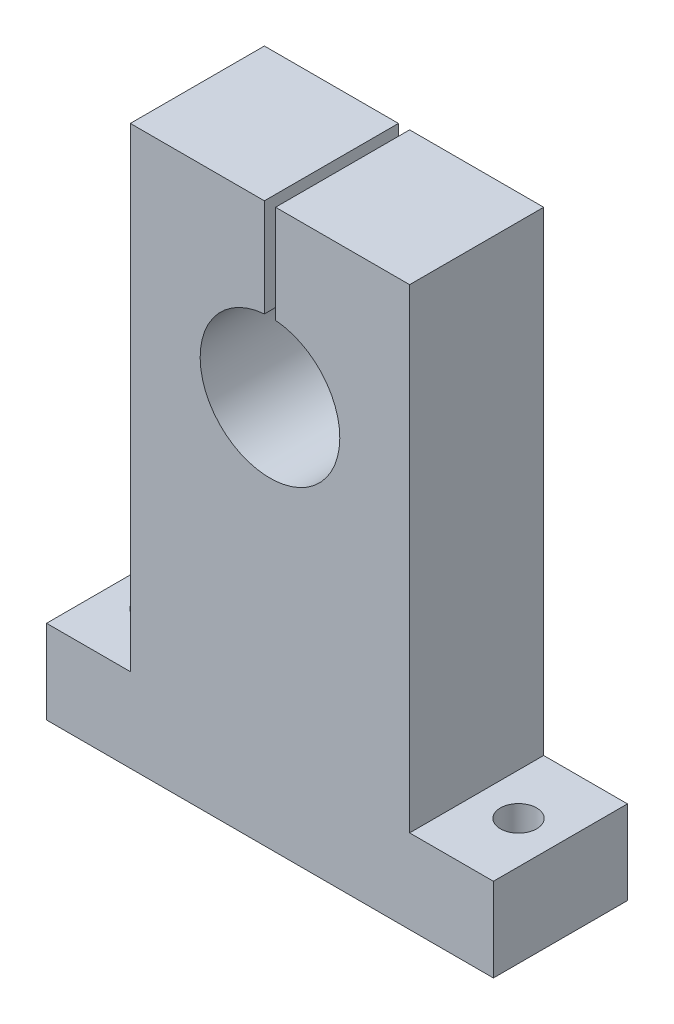
ISO-10303-21;
HEADER;
FILE_DESCRIPTION(('STEP AP214'),'2;1');
FILE_NAME('part.step','',(''),(''),'','','');
FILE_SCHEMA(('AUTOMOTIVE_DESIGN { 1 0 10303 214 1 1 1 1 }'));
ENDSEC;
DATA;
#1=APPLICATION_CONTEXT('core data for automotive mechanical design processes');
#2=APPLICATION_PROTOCOL_DEFINITION('international standard','automotive_design',2000,#1);
#3=PRODUCT_CONTEXT('',#1,'mechanical');
#4=PRODUCT('Part','Part','',(#3));
#5=PRODUCT_RELATED_PRODUCT_CATEGORY('part','',(#4));
#6=PRODUCT_DEFINITION_FORMATION('','',#4);
#7=PRODUCT_DEFINITION_CONTEXT('part definition',#1,'design');
#8=PRODUCT_DEFINITION('design','',#6,#7);
#9=PRODUCT_DEFINITION_SHAPE('','',#8);
#10=(LENGTH_UNIT() NAMED_UNIT(*) SI_UNIT(.MILLI.,.METRE.));
#11=(NAMED_UNIT(*) PLANE_ANGLE_UNIT() SI_UNIT($,.RADIAN.));
#12=(NAMED_UNIT(*) SI_UNIT($,.STERADIAN.) SOLID_ANGLE_UNIT());
#13=UNCERTAINTY_MEASURE_WITH_UNIT(LENGTH_MEASURE(1.E-05),#10,'distance_accuracy_value','');
#14=(GEOMETRIC_REPRESENTATION_CONTEXT(3) GLOBAL_UNCERTAINTY_ASSIGNED_CONTEXT((#13)) GLOBAL_UNIT_ASSIGNED_CONTEXT((#10,
#11,#12)) REPRESENTATION_CONTEXT('',''));
#15=CARTESIAN_POINT('',(0.,0.,0.));
#16=DIRECTION('',(0.,0.,1.));
#17=DIRECTION('',(1.,0.,0.));
#18=AXIS2_PLACEMENT_3D('',#15,#16,#17);
#19=CARTESIAN_POINT('',(-40.,-55.,12.));
#20=DIRECTION('',(1.,0.,0.));
#21=DIRECTION('',(0.,0.,-1.));
#22=AXIS2_PLACEMENT_3D('',#19,#20,#21);
#23=PLANE('',#22);
#24=DIRECTION('',(0.,-1.,0.));
#25=VECTOR('',#24,1.);
#26=CARTESIAN_POINT('',(-40.,-55.,-12.));
#27=LINE('',#26,#25);
#28=CARTESIAN_POINT('',(-40.,-55.,-12.));
#29=VERTEX_POINT('',#28);
#30=CARTESIAN_POINT('',(-40.,-70.,-12.));
#31=VERTEX_POINT('',#30);
#32=EDGE_CURVE('E155',#29,#31,#27,.T.);
#33=ORIENTED_EDGE('',*,*,#32,.T.);
#34=DIRECTION('',(0.,0.,-1.));
#35=VECTOR('',#34,1.);
#36=CARTESIAN_POINT('',(-40.,-70.,12.));
#37=LINE('',#36,#35);
#38=CARTESIAN_POINT('',(-40.,-70.,12.));
#39=VERTEX_POINT('',#38);
#40=EDGE_CURVE('E11',#39,#31,#37,.T.);
#41=ORIENTED_EDGE('',*,*,#40,.F.);
#42=DIRECTION('',(0.,-1.,0.));
#43=VECTOR('',#42,1.);
#44=CARTESIAN_POINT('',(-40.,-55.,12.));
#45=LINE('',#44,#43);
#46=CARTESIAN_POINT('',(-40.,-55.,12.));
#47=VERTEX_POINT('',#46);
#48=EDGE_CURVE('E178',#47,#39,#45,.T.);
#49=ORIENTED_EDGE('',*,*,#48,.F.);
#50=DIRECTION('',(0.,0.,-1.));
#51=VECTOR('',#50,1.);
#52=CARTESIAN_POINT('',(-40.,-55.,12.));
#53=LINE('',#52,#51);
#54=EDGE_CURVE('E151',#47,#29,#53,.T.);
#55=ORIENTED_EDGE('',*,*,#54,.T.);
#56=EDGE_LOOP('',(#33,#41,#49,#55));
#57=FACE_BOUND('',#56,.T.);
#58=ADVANCED_FACE('F35',(#57),#23,.F.);
#59=CARTESIAN_POINT('',(-40.,-70.,12.));
#60=DIRECTION('',(0.,1.,0.));
#61=DIRECTION('',(0.,0.,1.));
#62=AXIS2_PLACEMENT_3D('',#59,#60,#61);
#63=PLANE('',#62);
#64=CARTESIAN_POINT('',(-32.5,-70.,0.));
#65=DIRECTION('',(0.,1.,0.));
#66=DIRECTION('',(-1.,0.,0.));
#67=AXIS2_PLACEMENT_3D('',#64,#65,#66);
#68=CIRCLE('',#67,3.25);
#69=CARTESIAN_POINT('',(-35.75,-70.,0.));
#70=VERTEX_POINT('',#69);
#71=EDGE_CURVE('E159',#70,#70,#68,.T.);
#72=ORIENTED_EDGE('',*,*,#71,.T.);
#73=EDGE_LOOP('',(#72));
#74=FACE_BOUND('',#73,.T.);
#75=CARTESIAN_POINT('',(32.5,-70.,0.));
#76=DIRECTION('',(0.,1.,0.));
#77=DIRECTION('',(1.,0.,0.));
#78=AXIS2_PLACEMENT_3D('',#75,#76,#77);
#79=CIRCLE('',#78,3.25);
#80=CARTESIAN_POINT('',(35.75,-70.,0.));
#81=VERTEX_POINT('',#80);
#82=EDGE_CURVE('E353',#81,#81,#79,.T.);
#83=ORIENTED_EDGE('',*,*,#82,.T.);
#84=EDGE_LOOP('',(#83));
#85=FACE_BOUND('',#84,.T.);
#86=DIRECTION('',(1.,0.,0.));
#87=VECTOR('',#86,1.);
#88=CARTESIAN_POINT('',(-40.,-70.,-12.));
#89=LINE('',#88,#87);
#90=CARTESIAN_POINT('',(40.,-70.,-12.));
#91=VERTEX_POINT('',#90);
#92=EDGE_CURVE('E158',#31,#91,#89,.T.);
#93=ORIENTED_EDGE('',*,*,#92,.T.);
#94=DIRECTION('',(0.,0.,-1.));
#95=VECTOR('',#94,1.);
#96=CARTESIAN_POINT('',(40.,-70.,12.));
#97=LINE('',#96,#95);
#98=CARTESIAN_POINT('',(40.,-70.,12.));
#99=VERTEX_POINT('',#98);
#100=EDGE_CURVE('E43',#99,#91,#97,.T.);
#101=ORIENTED_EDGE('',*,*,#100,.F.);
#102=DIRECTION('',(1.,0.,0.));
#103=VECTOR('',#102,1.);
#104=CARTESIAN_POINT('',(-40.,-70.,12.));
#105=LINE('',#104,#103);
#106=EDGE_CURVE('E106',#39,#99,#105,.T.);
#107=ORIENTED_EDGE('',*,*,#106,.F.);
#108=ORIENTED_EDGE('',*,*,#40,.T.);
#109=EDGE_LOOP('',(#93,#101,#107,#108));
#110=FACE_BOUND('',#109,.T.);
#111=ADVANCED_FACE('F258',(#74,#85,#110),#63,.F.);
#112=CARTESIAN_POINT('',(40.,-70.,12.));
#113=DIRECTION('',(-1.,0.,0.));
#114=DIRECTION('',(0.,0.,1.));
#115=AXIS2_PLACEMENT_3D('',#112,#113,#114);
#116=PLANE('',#115);
#117=DIRECTION('',(0.,1.,0.));
#118=VECTOR('',#117,1.);
#119=CARTESIAN_POINT('',(40.,-70.,-12.));
#120=LINE('',#119,#118);
#121=CARTESIAN_POINT('',(40.,-55.,-12.));
#122=VERTEX_POINT('',#121);
#123=EDGE_CURVE('E161',#91,#122,#120,.T.);
#124=ORIENTED_EDGE('',*,*,#123,.T.);
#125=DIRECTION('',(0.,0.,-1.));
#126=VECTOR('',#125,1.);
#127=CARTESIAN_POINT('',(40.,-55.,12.));
#128=LINE('',#127,#126);
#129=CARTESIAN_POINT('',(40.,-55.,12.));
#130=VERTEX_POINT('',#129);
#131=EDGE_CURVE('E197',#130,#122,#128,.T.);
#132=ORIENTED_EDGE('',*,*,#131,.F.);
#133=DIRECTION('',(0.,1.,0.));
#134=VECTOR('',#133,1.);
#135=CARTESIAN_POINT('',(40.,-70.,12.));
#136=LINE('',#135,#134);
#137=EDGE_CURVE('E205',#99,#130,#136,.T.);
#138=ORIENTED_EDGE('',*,*,#137,.F.);
#139=ORIENTED_EDGE('',*,*,#100,.T.);
#140=EDGE_LOOP('',(#124,#132,#138,#139));
#141=FACE_BOUND('',#140,.T.);
#142=ADVANCED_FACE('F203',(#141),#116,.F.);
#143=CARTESIAN_POINT('',(40.,-55.,12.));
#144=DIRECTION('',(0.,-1.,0.));
#145=DIRECTION('',(1.,0.,0.));
#146=AXIS2_PLACEMENT_3D('',#143,#144,#145);
#147=PLANE('',#146);
#148=CARTESIAN_POINT('',(32.5,-55.,0.));
#149=DIRECTION('',(0.,1.,0.));
#150=DIRECTION('',(1.,0.,0.));
#151=AXIS2_PLACEMENT_3D('',#148,#149,#150);
#152=CIRCLE('',#151,3.25);
#153=CARTESIAN_POINT('',(35.75,-55.,0.));
#154=VERTEX_POINT('',#153);
#155=EDGE_CURVE('E356',#154,#154,#152,.T.);
#156=ORIENTED_EDGE('',*,*,#155,.F.);
#157=EDGE_LOOP('',(#156));
#158=FACE_BOUND('',#157,.T.);
#159=DIRECTION('',(-1.,0.,0.));
#160=VECTOR('',#159,1.);
#161=CARTESIAN_POINT('',(40.,-55.,-12.));
#162=LINE('',#161,#160);
#163=CARTESIAN_POINT('',(25.,-55.,-12.));
#164=VERTEX_POINT('',#163);
#165=EDGE_CURVE('E163',#122,#164,#162,.T.);
#166=ORIENTED_EDGE('',*,*,#165,.T.);
#167=DIRECTION('',(0.,0.,-1.));
#168=VECTOR('',#167,1.);
#169=CARTESIAN_POINT('',(25.,-55.,12.));
#170=LINE('',#169,#168);
#171=CARTESIAN_POINT('',(25.,-55.,12.));
#172=VERTEX_POINT('',#171);
#173=EDGE_CURVE('E194',#172,#164,#170,.T.);
#174=ORIENTED_EDGE('',*,*,#173,.F.);
#175=DIRECTION('',(-1.,0.,0.));
#176=VECTOR('',#175,1.);
#177=CARTESIAN_POINT('',(40.,-55.,12.));
#178=LINE('',#177,#176);
#179=EDGE_CURVE('E223',#130,#172,#178,.T.);
#180=ORIENTED_EDGE('',*,*,#179,.F.);
#181=ORIENTED_EDGE('',*,*,#131,.T.);
#182=EDGE_LOOP('',(#166,#174,#180,#181));
#183=FACE_BOUND('',#182,.T.);
#184=ADVANCED_FACE('F214',(#158,#183),#147,.F.);
#185=CARTESIAN_POINT('',(25.,-55.,12.));
#186=DIRECTION('',(-1.,0.,0.));
#187=DIRECTION('',(0.,0.,1.));
#188=AXIS2_PLACEMENT_3D('',#185,#186,#187);
#189=PLANE('',#188);
#190=DIRECTION('',(0.,1.,0.));
#191=VECTOR('',#190,1.);
#192=CARTESIAN_POINT('',(25.,-55.,-12.));
#193=LINE('',#192,#191);
#194=CARTESIAN_POINT('',(25.,30.,-12.));
#195=VERTEX_POINT('',#194);
#196=EDGE_CURVE('E165',#164,#195,#193,.T.);
#197=ORIENTED_EDGE('',*,*,#196,.T.);
#198=DIRECTION('',(0.,0.,-1.));
#199=VECTOR('',#198,1.);
#200=CARTESIAN_POINT('',(25.,30.,12.));
#201=LINE('',#200,#199);
#202=CARTESIAN_POINT('',(25.,30.,12.));
#203=VERTEX_POINT('',#202);
#204=EDGE_CURVE('E191',#203,#195,#201,.T.);
#205=ORIENTED_EDGE('',*,*,#204,.F.);
#206=DIRECTION('',(0.,1.,0.));
#207=VECTOR('',#206,1.);
#208=CARTESIAN_POINT('',(25.,-55.,12.));
#209=LINE('',#208,#207);
#210=EDGE_CURVE('E220',#172,#203,#209,.T.);
#211=ORIENTED_EDGE('',*,*,#210,.F.);
#212=ORIENTED_EDGE('',*,*,#173,.T.);
#213=EDGE_LOOP('',(#197,#205,#211,#212));
#214=FACE_BOUND('',#213,.T.);
#215=ADVANCED_FACE('F218',(#214),#189,.F.);
#216=CARTESIAN_POINT('',(25.,30.,12.));
#217=DIRECTION('',(0.,-1.,0.));
#218=DIRECTION('',(1.,0.,0.));
#219=AXIS2_PLACEMENT_3D('',#216,#217,#218);
#220=PLANE('',#219);
#221=DIRECTION('',(-1.,0.,0.));
#222=VECTOR('',#221,1.);
#223=CARTESIAN_POINT('',(25.,30.,-12.));
#224=LINE('',#223,#222);
#225=CARTESIAN_POINT('',(1.,30.,-12.));
#226=VERTEX_POINT('',#225);
#227=EDGE_CURVE('E167',#195,#226,#224,.T.);
#228=ORIENTED_EDGE('',*,*,#227,.T.);
#229=DIRECTION('',(0.,0.,-1.));
#230=VECTOR('',#229,1.);
#231=CARTESIAN_POINT('',(1.,30.,12.));
#232=LINE('',#231,#230);
#233=CARTESIAN_POINT('',(1.,30.,12.));
#234=VERTEX_POINT('',#233);
#235=EDGE_CURVE('E188',#234,#226,#232,.T.);
#236=ORIENTED_EDGE('',*,*,#235,.F.);
#237=DIRECTION('',(-1.,0.,0.));
#238=VECTOR('',#237,1.);
#239=CARTESIAN_POINT('',(25.,30.,12.));
#240=LINE('',#239,#238);
#241=EDGE_CURVE('E222',#203,#234,#240,.T.);
#242=ORIENTED_EDGE('',*,*,#241,.F.);
#243=ORIENTED_EDGE('',*,*,#204,.T.);
#244=EDGE_LOOP('',(#228,#236,#242,#243));
#245=FACE_BOUND('',#244,.T.);
#246=ADVANCED_FACE('F275',(#245),#220,.F.);
#247=CARTESIAN_POINT('',(1.,30.,12.));
#248=DIRECTION('',(1.,0.,0.));
#249=DIRECTION('',(0.,1.,0.));
#250=AXIS2_PLACEMENT_3D('',#247,#248,#249);
#251=PLANE('',#250);
#252=DIRECTION('',(0.,-1.,0.));
#253=VECTOR('',#252,1.);
#254=CARTESIAN_POINT('',(1.,30.,-12.));
#255=LINE('',#254,#253);
#256=CARTESIAN_POINT('',(1.,12.4599357943771,-12.));
#257=VERTEX_POINT('',#256);
#258=EDGE_CURVE('E169',#226,#257,#255,.T.);
#259=ORIENTED_EDGE('',*,*,#258,.T.);
#260=DIRECTION('',(0.,0.,-1.));
#261=VECTOR('',#260,1.);
#262=CARTESIAN_POINT('',(1.,12.4599357943771,12.));
#263=LINE('',#262,#261);
#264=CARTESIAN_POINT('',(1.,12.4599357943771,12.));
#265=VERTEX_POINT('',#264);
#266=EDGE_CURVE('E185',#265,#257,#263,.T.);
#267=ORIENTED_EDGE('',*,*,#266,.F.);
#268=DIRECTION('',(0.,-1.,0.));
#269=VECTOR('',#268,1.);
#270=CARTESIAN_POINT('',(1.,30.,12.));
#271=LINE('',#270,#269);
#272=EDGE_CURVE('E225',#234,#265,#271,.T.);
#273=ORIENTED_EDGE('',*,*,#272,.F.);
#274=ORIENTED_EDGE('',*,*,#235,.T.);
#275=EDGE_LOOP('',(#259,#267,#273,#274));
#276=FACE_BOUND('',#275,.T.);
#277=ADVANCED_FACE('F278',(#276),#251,.F.);
#278=CARTESIAN_POINT('',(0.,0.,12.));
#279=DIRECTION('',(0.,0.,-1.));
#280=DIRECTION('',(-1.,0.,0.));
#281=AXIS2_PLACEMENT_3D('',#278,#279,#280);
#282=CYLINDRICAL_SURFACE('',#281,12.5);
#283=CARTESIAN_POINT('',(0.,0.,-12.));
#284=DIRECTION('',(0.,0.,-1.));
#285=DIRECTION('',(1.,0.,0.));
#286=AXIS2_PLACEMENT_3D('',#283,#284,#285);
#287=CIRCLE('',#286,12.5);
#288=CARTESIAN_POINT('',(-1.,12.4599357943771,-12.));
#289=VERTEX_POINT('',#288);
#290=EDGE_CURVE('E171',#257,#289,#287,.T.);
#291=ORIENTED_EDGE('',*,*,#290,.T.);
#292=DIRECTION('',(0.,0.,-1.));
#293=VECTOR('',#292,1.);
#294=CARTESIAN_POINT('',(-1.,12.4599357943771,12.));
#295=LINE('',#294,#293);
#296=CARTESIAN_POINT('',(-1.,12.4599357943771,12.));
#297=VERTEX_POINT('',#296);
#298=EDGE_CURVE('E182',#297,#289,#295,.T.);
#299=ORIENTED_EDGE('',*,*,#298,.F.);
#300=CARTESIAN_POINT('',(0.,0.,12.));
#301=DIRECTION('',(0.,0.,-1.));
#302=DIRECTION('',(1.,0.,0.));
#303=AXIS2_PLACEMENT_3D('',#300,#301,#302);
#304=CIRCLE('',#303,12.5);
#305=EDGE_CURVE('E231',#265,#297,#304,.T.);
#306=ORIENTED_EDGE('',*,*,#305,.F.);
#307=ORIENTED_EDGE('',*,*,#266,.T.);
#308=EDGE_LOOP('',(#291,#299,#306,#307));
#309=FACE_BOUND('',#308,.T.);
#310=ADVANCED_FACE('F237',(#309),#282,.F.);
#311=CARTESIAN_POINT('',(-1.,30.,12.));
#312=DIRECTION('',(-1.,0.,0.));
#313=DIRECTION('',(0.,-1.,0.));
#314=AXIS2_PLACEMENT_3D('',#311,#312,#313);
#315=PLANE('',#314);
#316=DIRECTION('',(0.,1.,0.));
#317=VECTOR('',#316,1.);
#318=CARTESIAN_POINT('',(-1.,30.,-12.));
#319=LINE('',#318,#317);
#320=CARTESIAN_POINT('',(-1.,30.,-12.));
#321=VERTEX_POINT('',#320);
#322=EDGE_CURVE('E173',#289,#321,#319,.T.);
#323=ORIENTED_EDGE('',*,*,#322,.T.);
#324=DIRECTION('',(0.,0.,-1.));
#325=VECTOR('',#324,1.);
#326=CARTESIAN_POINT('',(-1.,30.,12.));
#327=LINE('',#326,#325);
#328=CARTESIAN_POINT('',(-1.,30.,12.));
#329=VERTEX_POINT('',#328);
#330=EDGE_CURVE('E146',#329,#321,#327,.T.);
#331=ORIENTED_EDGE('',*,*,#330,.F.);
#332=DIRECTION('',(0.,1.,0.));
#333=VECTOR('',#332,1.);
#334=CARTESIAN_POINT('',(-1.,30.,12.));
#335=LINE('',#334,#333);
#336=EDGE_CURVE('E137',#297,#329,#335,.T.);
#337=ORIENTED_EDGE('',*,*,#336,.F.);
#338=ORIENTED_EDGE('',*,*,#298,.T.);
#339=EDGE_LOOP('',(#323,#331,#337,#338));
#340=FACE_BOUND('',#339,.T.);
#341=ADVANCED_FACE('F241',(#340),#315,.F.);
#342=CARTESIAN_POINT('',(-1.,30.,12.));
#343=DIRECTION('',(0.,-1.,0.));
#344=DIRECTION('',(1.,0.,0.));
#345=AXIS2_PLACEMENT_3D('',#342,#343,#344);
#346=PLANE('',#345);
#347=DIRECTION('',(-1.,0.,0.));
#348=VECTOR('',#347,1.);
#349=CARTESIAN_POINT('',(-1.,30.,-12.));
#350=LINE('',#349,#348);
#351=CARTESIAN_POINT('',(-25.,30.,-12.));
#352=VERTEX_POINT('',#351);
#353=EDGE_CURVE('E145',#321,#352,#350,.T.);
#354=ORIENTED_EDGE('',*,*,#353,.T.);
#355=DIRECTION('',(0.,0.,-1.));
#356=VECTOR('',#355,1.);
#357=CARTESIAN_POINT('',(-25.,30.,12.));
#358=LINE('',#357,#356);
#359=CARTESIAN_POINT('',(-25.,30.,12.));
#360=VERTEX_POINT('',#359);
#361=EDGE_CURVE('E142',#360,#352,#358,.T.);
#362=ORIENTED_EDGE('',*,*,#361,.F.);
#363=DIRECTION('',(-1.,0.,0.));
#364=VECTOR('',#363,1.);
#365=CARTESIAN_POINT('',(-1.,30.,12.));
#366=LINE('',#365,#364);
#367=EDGE_CURVE('E131',#329,#360,#366,.T.);
#368=ORIENTED_EDGE('',*,*,#367,.F.);
#369=ORIENTED_EDGE('',*,*,#330,.T.);
#370=EDGE_LOOP('',(#354,#362,#368,#369));
#371=FACE_BOUND('',#370,.T.);
#372=ADVANCED_FACE('F143',(#371),#346,.F.);
#373=CARTESIAN_POINT('',(-25.,30.,12.));
#374=DIRECTION('',(1.,0.,0.));
#375=DIRECTION('',(0.,0.,-1.));
#376=AXIS2_PLACEMENT_3D('',#373,#374,#375);
#377=PLANE('',#376);
#378=DIRECTION('',(0.,-1.,0.));
#379=VECTOR('',#378,1.);
#380=CARTESIAN_POINT('',(-25.,30.,-12.));
#381=LINE('',#380,#379);
#382=CARTESIAN_POINT('',(-25.,-55.,-12.));
#383=VERTEX_POINT('',#382);
#384=EDGE_CURVE('E92',#352,#383,#381,.T.);
#385=ORIENTED_EDGE('',*,*,#384,.T.);
#386=DIRECTION('',(0.,0.,-1.));
#387=VECTOR('',#386,1.);
#388=CARTESIAN_POINT('',(-25.,-55.,12.));
#389=LINE('',#388,#387);
#390=CARTESIAN_POINT('',(-25.,-55.,12.));
#391=VERTEX_POINT('',#390);
#392=EDGE_CURVE('E147',#391,#383,#389,.T.);
#393=ORIENTED_EDGE('',*,*,#392,.F.);
#394=DIRECTION('',(0.,-1.,0.));
#395=VECTOR('',#394,1.);
#396=CARTESIAN_POINT('',(-25.,30.,12.));
#397=LINE('',#396,#395);
#398=EDGE_CURVE('E135',#360,#391,#397,.T.);
#399=ORIENTED_EDGE('',*,*,#398,.F.);
#400=ORIENTED_EDGE('',*,*,#361,.T.);
#401=EDGE_LOOP('',(#385,#393,#399,#400));
#402=FACE_BOUND('',#401,.T.);
#403=ADVANCED_FACE('F149',(#402),#377,.F.);
#404=CARTESIAN_POINT('',(-25.,-55.,12.));
#405=DIRECTION('',(0.,-1.,0.));
#406=DIRECTION('',(1.,0.,0.));
#407=AXIS2_PLACEMENT_3D('',#404,#405,#406);
#408=PLANE('',#407);
#409=CARTESIAN_POINT('',(-32.5,-55.,0.));
#410=DIRECTION('',(0.,1.,0.));
#411=DIRECTION('',(-1.,0.,0.));
#412=AXIS2_PLACEMENT_3D('',#409,#410,#411);
#413=CIRCLE('',#412,3.25);
#414=CARTESIAN_POINT('',(-35.75,-55.,0.));
#415=VERTEX_POINT('',#414);
#416=EDGE_CURVE('E358',#415,#415,#413,.T.);
#417=ORIENTED_EDGE('',*,*,#416,.F.);
#418=EDGE_LOOP('',(#417));
#419=FACE_BOUND('',#418,.T.);
#420=DIRECTION('',(-1.,0.,0.));
#421=VECTOR('',#420,1.);
#422=CARTESIAN_POINT('',(-25.,-55.,-12.));
#423=LINE('',#422,#421);
#424=EDGE_CURVE('E98',#383,#29,#423,.T.);
#425=ORIENTED_EDGE('',*,*,#424,.T.);
#426=ORIENTED_EDGE('',*,*,#54,.F.);
#427=DIRECTION('',(-1.,0.,0.));
#428=VECTOR('',#427,1.);
#429=CARTESIAN_POINT('',(-25.,-55.,12.));
#430=LINE('',#429,#428);
#431=EDGE_CURVE('E51',#391,#47,#430,.T.);
#432=ORIENTED_EDGE('',*,*,#431,.F.);
#433=ORIENTED_EDGE('',*,*,#392,.T.);
#434=EDGE_LOOP('',(#425,#426,#432,#433));
#435=FACE_BOUND('',#434,.T.);
#436=ADVANCED_FACE('F245',(#419,#435),#408,.F.);
#437=CARTESIAN_POINT('',(0.,0.,12.));
#438=DIRECTION('',(0.,0.,1.));
#439=DIRECTION('',(1.,0.,0.));
#440=AXIS2_PLACEMENT_3D('',#437,#438,#439);
#441=PLANE('',#440);
#442=ORIENTED_EDGE('',*,*,#48,.T.);
#443=ORIENTED_EDGE('',*,*,#106,.T.);
#444=ORIENTED_EDGE('',*,*,#137,.T.);
#445=ORIENTED_EDGE('',*,*,#179,.T.);
#446=ORIENTED_EDGE('',*,*,#210,.T.);
#447=ORIENTED_EDGE('',*,*,#241,.T.);
#448=ORIENTED_EDGE('',*,*,#272,.T.);
#449=ORIENTED_EDGE('',*,*,#305,.T.);
#450=ORIENTED_EDGE('',*,*,#336,.T.);
#451=ORIENTED_EDGE('',*,*,#367,.T.);
#452=ORIENTED_EDGE('',*,*,#398,.T.);
#453=ORIENTED_EDGE('',*,*,#431,.T.);
#454=EDGE_LOOP('',(#442,#443,#444,#445,#446,#447,#448,#449,#450,#451,#452,#453));
#455=FACE_BOUND('',#454,.T.);
#456=ADVANCED_FACE('F133',(#455),#441,.T.);
#457=CARTESIAN_POINT('',(0.,0.,-12.));
#458=DIRECTION('',(0.,0.,1.));
#459=DIRECTION('',(1.,0.,0.));
#460=AXIS2_PLACEMENT_3D('',#457,#458,#459);
#461=PLANE('',#460);
#462=ORIENTED_EDGE('',*,*,#32,.F.);
#463=ORIENTED_EDGE('',*,*,#424,.F.);
#464=ORIENTED_EDGE('',*,*,#384,.F.);
#465=ORIENTED_EDGE('',*,*,#353,.F.);
#466=ORIENTED_EDGE('',*,*,#322,.F.);
#467=ORIENTED_EDGE('',*,*,#290,.F.);
#468=ORIENTED_EDGE('',*,*,#258,.F.);
#469=ORIENTED_EDGE('',*,*,#227,.F.);
#470=ORIENTED_EDGE('',*,*,#196,.F.);
#471=ORIENTED_EDGE('',*,*,#165,.F.);
#472=ORIENTED_EDGE('',*,*,#123,.F.);
#473=ORIENTED_EDGE('',*,*,#92,.F.);
#474=EDGE_LOOP('',(#462,#463,#464,#465,#466,#467,#468,#469,#470,#471,#472,#473));
#475=FACE_BOUND('',#474,.T.);
#476=ADVANCED_FACE('F209',(#475),#461,.F.);
#477=CARTESIAN_POINT('',(-32.5,-70.,0.));
#478=DIRECTION('',(0.,1.,0.));
#479=DIRECTION('',(-1.,0.,0.));
#480=AXIS2_PLACEMENT_3D('',#477,#478,#479);
#481=CYLINDRICAL_SURFACE('',#480,3.25);
#482=ORIENTED_EDGE('',*,*,#71,.F.);
#483=EDGE_LOOP('',(#482));
#484=FACE_BOUND('',#483,.T.);
#485=ORIENTED_EDGE('',*,*,#416,.T.);
#486=EDGE_LOOP('',(#485));
#487=FACE_BOUND('',#486,.T.);
#488=ADVANCED_FACE('F311',(#484,#487),#481,.F.);
#489=CARTESIAN_POINT('',(32.5,-70.,0.));
#490=DIRECTION('',(0.,1.,0.));
#491=DIRECTION('',(-1.,0.,0.));
#492=AXIS2_PLACEMENT_3D('',#489,#490,#491);
#493=CYLINDRICAL_SURFACE('',#492,3.25);
#494=ORIENTED_EDGE('',*,*,#82,.F.);
#495=EDGE_LOOP('',(#494));
#496=FACE_BOUND('',#495,.T.);
#497=ORIENTED_EDGE('',*,*,#155,.T.);
#498=EDGE_LOOP('',(#497));
#499=FACE_BOUND('',#498,.T.);
#500=ADVANCED_FACE('F336',(#496,#499),#493,.F.);
#501=CLOSED_SHELL('',(#58,#111,#142,#184,#215,#246,#277,#310,#341,#372,#403,#436,#456,#476,#488,#500));
#502=MANIFOLD_SOLID_BREP('B2',#501);
#503=ADVANCED_BREP_SHAPE_REPRESENTATION('',(#18,#502),#14);
#504=SHAPE_DEFINITION_REPRESENTATION(#9,#503);
ENDSEC;
END-ISO-10303-21;
